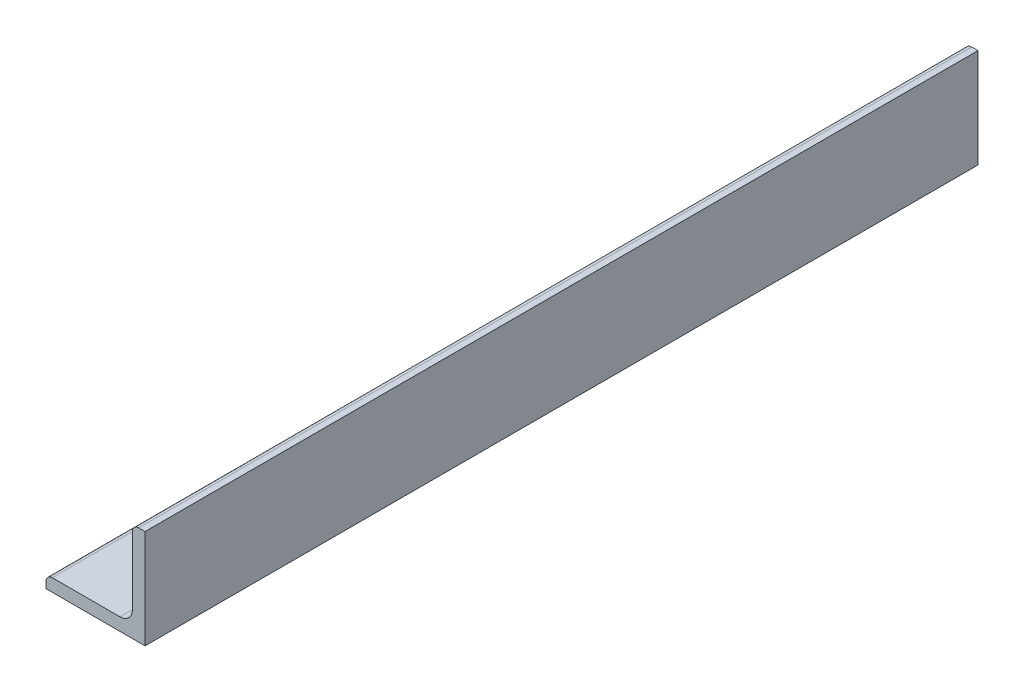
ISO-10303-21;
HEADER;
FILE_DESCRIPTION(('STEP AP214'),'2;1');
FILE_NAME('part.step','',(''),(''),'','','');
FILE_SCHEMA(('AUTOMOTIVE_DESIGN { 1 0 10303 214 1 1 1 1 }'));
ENDSEC;
DATA;
#1=APPLICATION_CONTEXT('core data for automotive mechanical design processes');
#2=APPLICATION_PROTOCOL_DEFINITION('international standard','automotive_design',2000,#1);
#3=PRODUCT_CONTEXT('',#1,'mechanical');
#4=PRODUCT('Part','Part','',(#3));
#5=PRODUCT_RELATED_PRODUCT_CATEGORY('part','',(#4));
#6=PRODUCT_DEFINITION_FORMATION('','',#4);
#7=PRODUCT_DEFINITION_CONTEXT('part definition',#1,'design');
#8=PRODUCT_DEFINITION('design','',#6,#7);
#9=PRODUCT_DEFINITION_SHAPE('','',#8);
#10=(LENGTH_UNIT() NAMED_UNIT(*) SI_UNIT(.MILLI.,.METRE.));
#11=(NAMED_UNIT(*) PLANE_ANGLE_UNIT() SI_UNIT($,.RADIAN.));
#12=(NAMED_UNIT(*) SI_UNIT($,.STERADIAN.) SOLID_ANGLE_UNIT());
#13=UNCERTAINTY_MEASURE_WITH_UNIT(LENGTH_MEASURE(1.E-05),#10,'distance_accuracy_value','');
#14=(GEOMETRIC_REPRESENTATION_CONTEXT(3) GLOBAL_UNCERTAINTY_ASSIGNED_CONTEXT((#13)) GLOBAL_UNIT_ASSIGNED_CONTEXT((#10,
#11,#12)) REPRESENTATION_CONTEXT('',''));
#15=CARTESIAN_POINT('',(0.,0.,0.));
#16=DIRECTION('',(0.,0.,1.));
#17=DIRECTION('',(1.,0.,0.));
#18=AXIS2_PLACEMENT_3D('',#15,#16,#17);
#19=CARTESIAN_POINT('',(-12.7,-11.0749969,152.4));
#20=DIRECTION('',(1.,0.,0.));
#21=DIRECTION('',(0.,0.,-1.));
#22=AXIS2_PLACEMENT_3D('',#19,#20,#21);
#23=PLANE('',#22);
#24=DIRECTION('',(0.,0.,-1.));
#25=VECTOR('',#24,1.);
#26=CARTESIAN_POINT('',(-12.7,-12.7,152.4));
#27=LINE('',#26,#25);
#28=CARTESIAN_POINT('',(-12.7,-12.7,102.95));
#29=VERTEX_POINT('',#28);
#30=CARTESIAN_POINT('',(-12.7,-12.7,-110.65));
#31=VERTEX_POINT('',#30);
#32=EDGE_CURVE('E114',#29,#31,#27,.T.);
#33=ORIENTED_EDGE('',*,*,#32,.F.);
#34=DIRECTION('',(0.,1.,0.));
#35=VECTOR('',#34,1.);
#36=CARTESIAN_POINT('',(-12.7,-12.7,102.95));
#37=LINE('',#36,#35);
#38=CARTESIAN_POINT('',(-12.7,-11.0749969,102.95));
#39=VERTEX_POINT('',#38);
#40=EDGE_CURVE('E102',#29,#39,#37,.T.);
#41=ORIENTED_EDGE('',*,*,#40,.T.);
#42=DIRECTION('',(0.,0.,-1.));
#43=VECTOR('',#42,1.);
#44=CARTESIAN_POINT('',(-12.7,-11.0749969,152.4));
#45=LINE('',#44,#43);
#46=CARTESIAN_POINT('',(-12.7,-11.0749969,-110.65));
#47=VERTEX_POINT('',#46);
#48=EDGE_CURVE('E55',#39,#47,#45,.T.);
#49=ORIENTED_EDGE('',*,*,#48,.T.);
#50=DIRECTION('',(0.,-1.,0.));
#51=VECTOR('',#50,1.);
#52=CARTESIAN_POINT('',(-12.7,-11.0749969,-110.65));
#53=LINE('',#52,#51);
#54=EDGE_CURVE('E119',#47,#31,#53,.T.);
#55=ORIENTED_EDGE('',*,*,#54,.T.);
#56=EDGE_LOOP('',(#33,#41,#49,#55));
#57=FACE_BOUND('',#56,.T.);
#58=ADVANCED_FACE('F34',(#57),#23,.F.);
#59=CARTESIAN_POINT('',(-12.7,-12.7,152.4));
#60=DIRECTION('',(0.,1.,0.));
#61=DIRECTION('',(-1.,0.,0.));
#62=AXIS2_PLACEMENT_3D('',#59,#60,#61);
#63=PLANE('',#62);
#64=DIRECTION('',(0.,0.,-1.));
#65=VECTOR('',#64,1.);
#66=CARTESIAN_POINT('',(12.7,-12.7,152.4));
#67=LINE('',#66,#65);
#68=CARTESIAN_POINT('',(12.7,-12.7,102.95));
#69=VERTEX_POINT('',#68);
#70=CARTESIAN_POINT('',(12.7,-12.7,-110.65));
#71=VERTEX_POINT('',#70);
#72=EDGE_CURVE('E116',#69,#71,#67,.T.);
#73=ORIENTED_EDGE('',*,*,#72,.F.);
#74=DIRECTION('',(1.,0.,0.));
#75=VECTOR('',#74,1.);
#76=CARTESIAN_POINT('',(-12.7,-12.7,102.95));
#77=LINE('',#76,#75);
#78=EDGE_CURVE('E105',#29,#69,#77,.T.);
#79=ORIENTED_EDGE('',*,*,#78,.F.);
#80=ORIENTED_EDGE('',*,*,#32,.T.);
#81=DIRECTION('',(1.,0.,0.));
#82=VECTOR('',#81,1.);
#83=CARTESIAN_POINT('',(-12.7,-12.7,-110.65));
#84=LINE('',#83,#82);
#85=EDGE_CURVE('E138',#31,#71,#84,.T.);
#86=ORIENTED_EDGE('',*,*,#85,.T.);
#87=EDGE_LOOP('',(#73,#79,#80,#86));
#88=FACE_BOUND('',#87,.T.);
#89=ADVANCED_FACE('F112',(#88),#63,.F.);
#90=CARTESIAN_POINT('',(12.7,-12.7,152.4));
#91=DIRECTION('',(-1.,0.,0.));
#92=DIRECTION('',(0.,-1.,0.));
#93=AXIS2_PLACEMENT_3D('',#90,#91,#92);
#94=PLANE('',#93);
#95=DIRECTION('',(0.,0.,-1.));
#96=VECTOR('',#95,1.);
#97=CARTESIAN_POINT('',(12.7,12.7,152.4));
#98=LINE('',#97,#96);
#99=CARTESIAN_POINT('',(12.7,12.7,102.95));
#100=VERTEX_POINT('',#99);
#101=CARTESIAN_POINT('',(12.7,12.7,-110.65));
#102=VERTEX_POINT('',#101);
#103=EDGE_CURVE('E122',#100,#102,#98,.T.);
#104=ORIENTED_EDGE('',*,*,#103,.F.);
#105=DIRECTION('',(0.,1.,0.));
#106=VECTOR('',#105,1.);
#107=CARTESIAN_POINT('',(12.7,-12.7,102.95));
#108=LINE('',#107,#106);
#109=EDGE_CURVE('E108',#69,#100,#108,.T.);
#110=ORIENTED_EDGE('',*,*,#109,.F.);
#111=ORIENTED_EDGE('',*,*,#72,.T.);
#112=DIRECTION('',(0.,1.,0.));
#113=VECTOR('',#112,1.);
#114=CARTESIAN_POINT('',(12.7,-12.7,-110.65));
#115=LINE('',#114,#113);
#116=EDGE_CURVE('E140',#71,#102,#115,.T.);
#117=ORIENTED_EDGE('',*,*,#116,.T.);
#118=EDGE_LOOP('',(#104,#110,#111,#117));
#119=FACE_BOUND('',#118,.T.);
#120=ADVANCED_FACE('F176',(#119),#94,.F.);
#121=CARTESIAN_POINT('',(11.0749969,12.7,152.4));
#122=DIRECTION('',(0.,-1.,0.));
#123=DIRECTION('',(1.,0.,0.));
#124=AXIS2_PLACEMENT_3D('',#121,#122,#123);
#125=PLANE('',#124);
#126=DIRECTION('',(0.,0.,-1.));
#127=VECTOR('',#126,1.);
#128=CARTESIAN_POINT('',(11.0749969,12.7,152.4));
#129=LINE('',#128,#127);
#130=CARTESIAN_POINT('',(11.0749969,12.7,102.95));
#131=VERTEX_POINT('',#130);
#132=CARTESIAN_POINT('',(11.0749969,12.7,-110.65));
#133=VERTEX_POINT('',#132);
#134=EDGE_CURVE('E126',#131,#133,#129,.T.);
#135=ORIENTED_EDGE('',*,*,#134,.F.);
#136=DIRECTION('',(1.,0.,0.));
#137=VECTOR('',#136,1.);
#138=CARTESIAN_POINT('',(-12.7,12.7,102.95));
#139=LINE('',#138,#137);
#140=EDGE_CURVE('E117',#131,#100,#139,.T.);
#141=ORIENTED_EDGE('',*,*,#140,.T.);
#142=ORIENTED_EDGE('',*,*,#103,.T.);
#143=DIRECTION('',(-1.,0.,0.));
#144=VECTOR('',#143,1.);
#145=CARTESIAN_POINT('',(11.0749969,12.7,-110.65));
#146=LINE('',#145,#144);
#147=EDGE_CURVE('E143',#102,#133,#146,.T.);
#148=ORIENTED_EDGE('',*,*,#147,.T.);
#149=EDGE_LOOP('',(#135,#141,#142,#148));
#150=FACE_BOUND('',#149,.T.);
#151=ADVANCED_FACE('F174',(#150),#125,.F.);
#152=CARTESIAN_POINT('',(11.0749969,11.0749969,152.4));
#153=DIRECTION('',(0.,0.,-1.));
#154=DIRECTION('',(-1.,0.,0.));
#155=AXIS2_PLACEMENT_3D('',#152,#153,#154);
#156=CYLINDRICAL_SURFACE('',#155,1.6250031);
#157=DIRECTION('',(0.,0.,-1.));
#158=VECTOR('',#157,1.);
#159=CARTESIAN_POINT('',(9.4499938,11.0749969,152.4));
#160=LINE('',#159,#158);
#161=CARTESIAN_POINT('',(9.4499938,11.0749969,102.95));
#162=VERTEX_POINT('',#161);
#163=CARTESIAN_POINT('',(9.4499938,11.0749969,-110.65));
#164=VERTEX_POINT('',#163);
#165=EDGE_CURVE('E128',#162,#164,#160,.T.);
#166=ORIENTED_EDGE('',*,*,#165,.F.);
#167=CARTESIAN_POINT('',(11.0749969,11.0749969,102.95));
#168=DIRECTION('',(0.,0.,-1.));
#169=DIRECTION('',(-1.,0.,0.));
#170=AXIS2_PLACEMENT_3D('',#167,#168,#169);
#171=CIRCLE('',#170,1.6250031);
#172=EDGE_CURVE('E158',#162,#131,#171,.T.);
#173=ORIENTED_EDGE('',*,*,#172,.T.);
#174=ORIENTED_EDGE('',*,*,#134,.T.);
#175=CARTESIAN_POINT('',(11.0749969,11.0749969,-110.65));
#176=DIRECTION('',(0.,0.,1.));
#177=DIRECTION('',(1.,0.,0.));
#178=AXIS2_PLACEMENT_3D('',#175,#176,#177);
#179=CIRCLE('',#178,1.6250031);
#180=EDGE_CURVE('E146',#133,#164,#179,.T.);
#181=ORIENTED_EDGE('',*,*,#180,.T.);
#182=EDGE_LOOP('',(#166,#173,#174,#181));
#183=FACE_BOUND('',#182,.T.);
#184=ADVANCED_FACE('F186',(#183),#156,.T.);
#185=CARTESIAN_POINT('',(9.4499938,11.0749969,152.4));
#186=DIRECTION('',(1.,0.,0.));
#187=DIRECTION('',(0.,1.,0.));
#188=AXIS2_PLACEMENT_3D('',#185,#186,#187);
#189=PLANE('',#188);
#190=DIRECTION('',(0.,0.,-1.));
#191=VECTOR('',#190,1.);
#192=CARTESIAN_POINT('',(9.4499938,-6.27499379999999,152.4));
#193=LINE('',#192,#191);
#194=CARTESIAN_POINT('',(9.4499938,-6.27499379999999,102.95));
#195=VERTEX_POINT('',#194);
#196=CARTESIAN_POINT('',(9.4499938,-6.27499379999999,-110.65));
#197=VERTEX_POINT('',#196);
#198=EDGE_CURVE('E130',#195,#197,#193,.T.);
#199=ORIENTED_EDGE('',*,*,#198,.F.);
#200=DIRECTION('',(0.,1.,0.));
#201=VECTOR('',#200,1.);
#202=CARTESIAN_POINT('',(9.4499938,11.0749969,102.95));
#203=LINE('',#202,#201);
#204=EDGE_CURVE('E161',#195,#162,#203,.T.);
#205=ORIENTED_EDGE('',*,*,#204,.T.);
#206=ORIENTED_EDGE('',*,*,#165,.T.);
#207=DIRECTION('',(0.,-1.,0.));
#208=VECTOR('',#207,1.);
#209=CARTESIAN_POINT('',(9.4499938,11.0749969,-110.65));
#210=LINE('',#209,#208);
#211=EDGE_CURVE('E149',#164,#197,#210,.T.);
#212=ORIENTED_EDGE('',*,*,#211,.T.);
#213=EDGE_LOOP('',(#199,#205,#206,#212));
#214=FACE_BOUND('',#213,.T.);
#215=ADVANCED_FACE('F189',(#214),#189,.F.);
#216=CARTESIAN_POINT('',(6.2749938,-6.27499379999999,152.4));
#217=DIRECTION('',(0.,0.,-1.));
#218=DIRECTION('',(-1.,0.,0.));
#219=AXIS2_PLACEMENT_3D('',#216,#217,#218);
#220=CYLINDRICAL_SURFACE('',#219,3.175);
#221=DIRECTION('',(0.,0.,-1.));
#222=VECTOR('',#221,1.);
#223=CARTESIAN_POINT('',(6.2749938,-9.44999379999999,152.4));
#224=LINE('',#223,#222);
#225=CARTESIAN_POINT('',(6.2749938,-9.44999379999999,102.95));
#226=VERTEX_POINT('',#225);
#227=CARTESIAN_POINT('',(6.2749938,-9.44999379999999,-110.65));
#228=VERTEX_POINT('',#227);
#229=EDGE_CURVE('E132',#226,#228,#224,.T.);
#230=ORIENTED_EDGE('',*,*,#229,.F.);
#231=CARTESIAN_POINT('',(6.2749938,-6.27499379999999,102.95));
#232=DIRECTION('',(0.,0.,-1.));
#233=DIRECTION('',(-1.,0.,0.));
#234=AXIS2_PLACEMENT_3D('',#231,#232,#233);
#235=CIRCLE('',#234,3.175);
#236=EDGE_CURVE('E164',#226,#195,#235,.F.);
#237=ORIENTED_EDGE('',*,*,#236,.T.);
#238=ORIENTED_EDGE('',*,*,#198,.T.);
#239=CARTESIAN_POINT('',(6.2749938,-6.27499379999999,-110.65));
#240=DIRECTION('',(0.,0.,1.));
#241=DIRECTION('',(1.,0.,0.));
#242=AXIS2_PLACEMENT_3D('',#239,#240,#241);
#243=CIRCLE('',#242,3.175);
#244=EDGE_CURVE('E152',#197,#228,#243,.F.);
#245=ORIENTED_EDGE('',*,*,#244,.T.);
#246=EDGE_LOOP('',(#230,#237,#238,#245));
#247=FACE_BOUND('',#246,.T.);
#248=ADVANCED_FACE('F192',(#247),#220,.F.);
#249=CARTESIAN_POINT('',(6.2749938,-9.44999379999999,152.4));
#250=DIRECTION('',(0.,-1.,0.));
#251=DIRECTION('',(1.,0.,0.));
#252=AXIS2_PLACEMENT_3D('',#249,#250,#251);
#253=PLANE('',#252);
#254=DIRECTION('',(0.,0.,-1.));
#255=VECTOR('',#254,1.);
#256=CARTESIAN_POINT('',(-11.0749969,-9.44999379999999,152.4));
#257=LINE('',#256,#255);
#258=CARTESIAN_POINT('',(-11.0749969,-9.44999379999999,102.95));
#259=VERTEX_POINT('',#258);
#260=CARTESIAN_POINT('',(-11.0749969,-9.44999379999999,-110.65));
#261=VERTEX_POINT('',#260);
#262=EDGE_CURVE('E134',#259,#261,#257,.T.);
#263=ORIENTED_EDGE('',*,*,#262,.F.);
#264=DIRECTION('',(1.,0.,0.));
#265=VECTOR('',#264,1.);
#266=CARTESIAN_POINT('',(6.2749938,-9.44999379999999,102.95));
#267=LINE('',#266,#265);
#268=EDGE_CURVE('E48',#259,#226,#267,.T.);
#269=ORIENTED_EDGE('',*,*,#268,.T.);
#270=ORIENTED_EDGE('',*,*,#229,.T.);
#271=DIRECTION('',(-1.,0.,0.));
#272=VECTOR('',#271,1.);
#273=CARTESIAN_POINT('',(6.2749938,-9.44999379999999,-110.65));
#274=LINE('',#273,#272);
#275=EDGE_CURVE('E155',#228,#261,#274,.T.);
#276=ORIENTED_EDGE('',*,*,#275,.T.);
#277=EDGE_LOOP('',(#263,#269,#270,#276));
#278=FACE_BOUND('',#277,.T.);
#279=ADVANCED_FACE('F196',(#278),#253,.F.);
#280=CARTESIAN_POINT('',(-11.0749969,-11.0749969,152.4));
#281=DIRECTION('',(0.,0.,-1.));
#282=DIRECTION('',(-1.,0.,0.));
#283=AXIS2_PLACEMENT_3D('',#280,#281,#282);
#284=CYLINDRICAL_SURFACE('',#283,1.6250031);
#285=ORIENTED_EDGE('',*,*,#48,.F.);
#286=CARTESIAN_POINT('',(-11.0749969,-11.0749969,102.95));
#287=DIRECTION('',(0.,0.,-1.));
#288=DIRECTION('',(-1.,0.,0.));
#289=AXIS2_PLACEMENT_3D('',#286,#287,#288);
#290=CIRCLE('',#289,1.6250031);
#291=EDGE_CURVE('E11',#39,#259,#290,.T.);
#292=ORIENTED_EDGE('',*,*,#291,.T.);
#293=ORIENTED_EDGE('',*,*,#262,.T.);
#294=CARTESIAN_POINT('',(-11.0749969,-11.0749969,-110.65));
#295=DIRECTION('',(0.,0.,1.));
#296=DIRECTION('',(1.,0.,0.));
#297=AXIS2_PLACEMENT_3D('',#294,#295,#296);
#298=CIRCLE('',#297,1.6250031);
#299=EDGE_CURVE('E41',#261,#47,#298,.T.);
#300=ORIENTED_EDGE('',*,*,#299,.T.);
#301=EDGE_LOOP('',(#285,#292,#293,#300));
#302=FACE_BOUND('',#301,.T.);
#303=ADVANCED_FACE('F198',(#302),#284,.T.);
#304=CARTESIAN_POINT('',(0.,25.4,-110.65));
#305=DIRECTION('',(0.,0.,1.));
#306=DIRECTION('',(1.,0.,0.));
#307=AXIS2_PLACEMENT_3D('',#304,#305,#306);
#308=PLANE('',#307);
#309=ORIENTED_EDGE('',*,*,#299,.F.);
#310=ORIENTED_EDGE('',*,*,#275,.F.);
#311=ORIENTED_EDGE('',*,*,#244,.F.);
#312=ORIENTED_EDGE('',*,*,#211,.F.);
#313=ORIENTED_EDGE('',*,*,#180,.F.);
#314=ORIENTED_EDGE('',*,*,#147,.F.);
#315=ORIENTED_EDGE('',*,*,#116,.F.);
#316=ORIENTED_EDGE('',*,*,#85,.F.);
#317=ORIENTED_EDGE('',*,*,#54,.F.);
#318=EDGE_LOOP('',(#309,#310,#311,#312,#313,#314,#315,#316,#317));
#319=FACE_BOUND('',#318,.T.);
#320=ADVANCED_FACE('F180',(#319),#308,.F.);
#321=CARTESIAN_POINT('',(-12.7,-12.7,102.95));
#322=DIRECTION('',(0.,0.,-1.));
#323=DIRECTION('',(-1.,0.,0.));
#324=AXIS2_PLACEMENT_3D('',#321,#322,#323);
#325=PLANE('',#324);
#326=ORIENTED_EDGE('',*,*,#204,.F.);
#327=ORIENTED_EDGE('',*,*,#236,.F.);
#328=ORIENTED_EDGE('',*,*,#268,.F.);
#329=ORIENTED_EDGE('',*,*,#291,.F.);
#330=ORIENTED_EDGE('',*,*,#40,.F.);
#331=ORIENTED_EDGE('',*,*,#78,.T.);
#332=ORIENTED_EDGE('',*,*,#109,.T.);
#333=ORIENTED_EDGE('',*,*,#140,.F.);
#334=ORIENTED_EDGE('',*,*,#172,.F.);
#335=EDGE_LOOP('',(#326,#327,#328,#329,#330,#331,#332,#333,#334));
#336=FACE_BOUND('',#335,.T.);
#337=ADVANCED_FACE('F104',(#336),#325,.F.);
#338=CLOSED_SHELL('',(#58,#89,#120,#151,#184,#215,#248,#279,#303,#320,#337));
#339=MANIFOLD_SOLID_BREP('B2',#338);
#340=ADVANCED_BREP_SHAPE_REPRESENTATION('',(#18,#339),#14);
#341=SHAPE_DEFINITION_REPRESENTATION(#9,#340);
ENDSEC;
END-ISO-10303-21;
